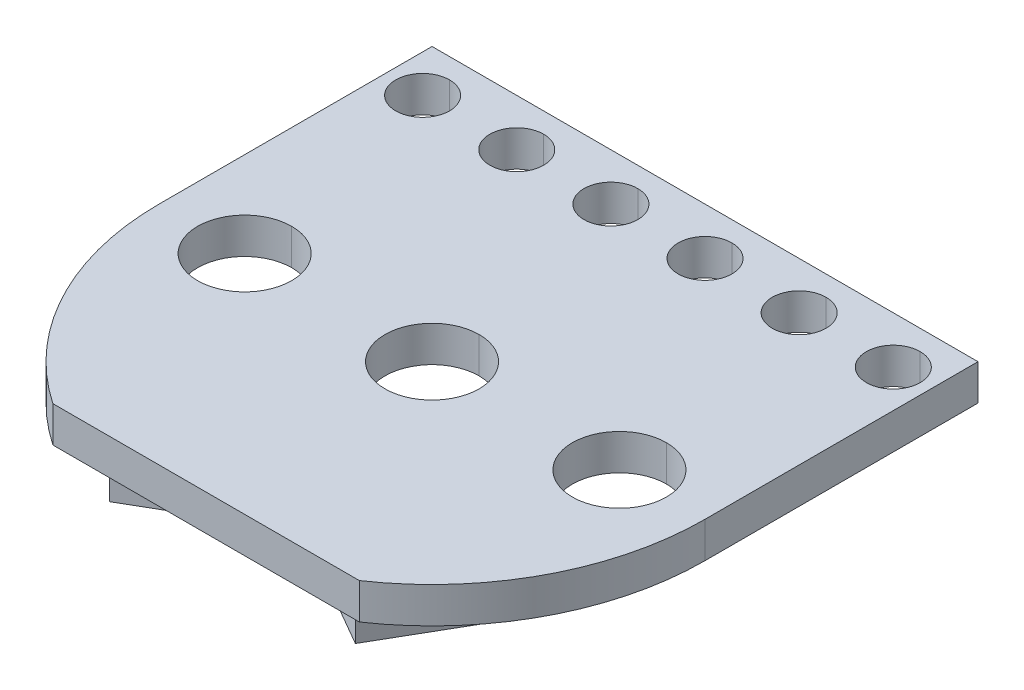
ISO-10303-21;
HEADER;
FILE_DESCRIPTION(('STEP AP214'),'2;1');
FILE_NAME('part.step','',(''),(''),'','','');
FILE_SCHEMA(('AUTOMOTIVE_DESIGN { 1 0 10303 214 1 1 1 1 }'));
ENDSEC;
DATA;
#1=APPLICATION_CONTEXT('core data for automotive mechanical design processes');
#2=APPLICATION_PROTOCOL_DEFINITION('international standard','automotive_design',2000,#1);
#3=PRODUCT_CONTEXT('',#1,'mechanical');
#4=PRODUCT('Part','Part','',(#3));
#5=PRODUCT_RELATED_PRODUCT_CATEGORY('part','',(#4));
#6=PRODUCT_DEFINITION_FORMATION('','',#4);
#7=PRODUCT_DEFINITION_CONTEXT('part definition',#1,'design');
#8=PRODUCT_DEFINITION('design','',#6,#7);
#9=PRODUCT_DEFINITION_SHAPE('','',#8);
#10=(LENGTH_UNIT() NAMED_UNIT(*) SI_UNIT(.MILLI.,.METRE.));
#11=(NAMED_UNIT(*) PLANE_ANGLE_UNIT() SI_UNIT($,.RADIAN.));
#12=(NAMED_UNIT(*) SI_UNIT($,.STERADIAN.) SOLID_ANGLE_UNIT());
#13=UNCERTAINTY_MEASURE_WITH_UNIT(LENGTH_MEASURE(1.E-05),#10,'distance_accuracy_value','');
#14=(GEOMETRIC_REPRESENTATION_CONTEXT(3) GLOBAL_UNCERTAINTY_ASSIGNED_CONTEXT((#13)) GLOBAL_UNIT_ASSIGNED_CONTEXT((#10,
#11,#12)) REPRESENTATION_CONTEXT('',''));
#15=CARTESIAN_POINT('',(0.,0.,0.));
#16=DIRECTION('',(0.,0.,1.));
#17=DIRECTION('',(1.,0.,0.));
#18=AXIS2_PLACEMENT_3D('',#15,#16,#17);
#19=CARTESIAN_POINT('',(3.9812,0.762,0.));
#20=DIRECTION('',(0.,-1.,0.));
#21=DIRECTION('',(0.,0.,-1.));
#22=AXIS2_PLACEMENT_3D('',#19,#20,#21);
#23=CYLINDRICAL_SURFACE('',#22,1.);
#24=CARTESIAN_POINT('',(3.9812,0.762,0.));
#25=DIRECTION('',(0.,1.,0.));
#26=DIRECTION('',(0.,0.,1.));
#27=AXIS2_PLACEMENT_3D('',#24,#25,#26);
#28=CIRCLE('',#27,1.);
#29=CARTESIAN_POINT('',(3.9812,0.762,-1.));
#30=VERTEX_POINT('',#29);
#31=CARTESIAN_POINT('',(3.9812,0.762,1.));
#32=VERTEX_POINT('',#31);
#33=EDGE_CURVE('E11',#30,#32,#28,.T.);
#34=ORIENTED_EDGE('',*,*,#33,.T.);
#35=DIRECTION('',(0.,-1.,0.));
#36=VECTOR('',#35,1.);
#37=CARTESIAN_POINT('',(3.9812,0.762,1.));
#38=LINE('',#37,#36);
#39=CARTESIAN_POINT('',(3.9812,0.,1.));
#40=VERTEX_POINT('',#39);
#41=EDGE_CURVE('E27',#32,#40,#38,.T.);
#42=ORIENTED_EDGE('',*,*,#41,.T.);
#43=CARTESIAN_POINT('',(3.9812,0.,0.));
#44=DIRECTION('',(0.,1.,0.));
#45=DIRECTION('',(0.,0.,1.));
#46=AXIS2_PLACEMENT_3D('',#43,#44,#45);
#47=CIRCLE('',#46,1.);
#48=CARTESIAN_POINT('',(3.9812,0.,-1.));
#49=VERTEX_POINT('',#48);
#50=EDGE_CURVE('E590',#49,#40,#47,.T.);
#51=ORIENTED_EDGE('',*,*,#50,.F.);
#52=DIRECTION('',(0.,-1.,0.));
#53=VECTOR('',#52,1.);
#54=CARTESIAN_POINT('',(3.9812,0.762,-1.));
#55=LINE('',#54,#53);
#56=EDGE_CURVE('E454',#30,#49,#55,.T.);
#57=ORIENTED_EDGE('',*,*,#56,.F.);
#58=EDGE_LOOP('',(#34,#42,#51,#57));
#59=FACE_BOUND('',#58,.T.);
#60=ADVANCED_FACE('F16',(#59),#23,.F.);
#61=CARTESIAN_POINT('',(5.,0.762,-4.8));
#62=DIRECTION('',(0.,-1.,0.));
#63=DIRECTION('',(0.,0.,-1.));
#64=AXIS2_PLACEMENT_3D('',#61,#62,#63);
#65=CYLINDRICAL_SURFACE('',#64,0.5715);
#66=CARTESIAN_POINT('',(5.,0.762,-4.8));
#67=DIRECTION('',(0.,1.,0.));
#68=DIRECTION('',(0.,0.,1.));
#69=AXIS2_PLACEMENT_3D('',#66,#67,#68);
#70=CIRCLE('',#69,0.5715);
#71=CARTESIAN_POINT('',(5.,0.762,-5.3715));
#72=VERTEX_POINT('',#71);
#73=CARTESIAN_POINT('',(5.,0.762,-4.2285));
#74=VERTEX_POINT('',#73);
#75=EDGE_CURVE('E392',#72,#74,#70,.T.);
#76=ORIENTED_EDGE('',*,*,#75,.T.);
#77=DIRECTION('',(0.,-1.,0.));
#78=VECTOR('',#77,1.);
#79=CARTESIAN_POINT('',(5.,0.762,-4.2285));
#80=LINE('',#79,#78);
#81=CARTESIAN_POINT('',(5.,0.,-4.2285));
#82=VERTEX_POINT('',#81);
#83=EDGE_CURVE('E375',#74,#82,#80,.T.);
#84=ORIENTED_EDGE('',*,*,#83,.T.);
#85=CARTESIAN_POINT('',(5.,0.,-4.8));
#86=DIRECTION('',(0.,1.,0.));
#87=DIRECTION('',(0.,0.,1.));
#88=AXIS2_PLACEMENT_3D('',#85,#86,#87);
#89=CIRCLE('',#88,0.5715);
#90=CARTESIAN_POINT('',(5.,0.,-5.3715));
#91=VERTEX_POINT('',#90);
#92=EDGE_CURVE('E474',#91,#82,#89,.T.);
#93=ORIENTED_EDGE('',*,*,#92,.F.);
#94=DIRECTION('',(0.,-1.,0.));
#95=VECTOR('',#94,1.);
#96=CARTESIAN_POINT('',(5.,0.762,-5.3715));
#97=LINE('',#96,#95);
#98=EDGE_CURVE('E417',#72,#91,#97,.T.);
#99=ORIENTED_EDGE('',*,*,#98,.F.);
#100=EDGE_LOOP('',(#76,#84,#93,#99));
#101=FACE_BOUND('',#100,.T.);
#102=ADVANCED_FACE('F703',(#101),#65,.F.);
#103=CARTESIAN_POINT('',(3.,0.762,-4.8));
#104=DIRECTION('',(0.,-1.,0.));
#105=DIRECTION('',(0.,0.,-1.));
#106=AXIS2_PLACEMENT_3D('',#103,#104,#105);
#107=CYLINDRICAL_SURFACE('',#106,0.5715);
#108=CARTESIAN_POINT('',(3.,0.762,-4.8));
#109=DIRECTION('',(0.,1.,0.));
#110=DIRECTION('',(0.,0.,1.));
#111=AXIS2_PLACEMENT_3D('',#108,#109,#110);
#112=CIRCLE('',#111,0.5715);
#113=CARTESIAN_POINT('',(3.,0.762,-5.3715));
#114=VERTEX_POINT('',#113);
#115=CARTESIAN_POINT('',(3.,0.762,-4.2285));
#116=VERTEX_POINT('',#115);
#117=EDGE_CURVE('E372',#114,#116,#112,.T.);
#118=ORIENTED_EDGE('',*,*,#117,.T.);
#119=DIRECTION('',(0.,-1.,0.));
#120=VECTOR('',#119,1.);
#121=CARTESIAN_POINT('',(3.,0.762,-4.2285));
#122=LINE('',#121,#120);
#123=CARTESIAN_POINT('',(3.,0.,-4.2285));
#124=VERTEX_POINT('',#123);
#125=EDGE_CURVE('E333',#116,#124,#122,.T.);
#126=ORIENTED_EDGE('',*,*,#125,.T.);
#127=CARTESIAN_POINT('',(3.,0.,-4.8));
#128=DIRECTION('',(0.,1.,0.));
#129=DIRECTION('',(0.,0.,1.));
#130=AXIS2_PLACEMENT_3D('',#127,#128,#129);
#131=CIRCLE('',#130,0.5715);
#132=CARTESIAN_POINT('',(3.,0.,-5.3715));
#133=VERTEX_POINT('',#132);
#134=EDGE_CURVE('E475',#133,#124,#131,.T.);
#135=ORIENTED_EDGE('',*,*,#134,.F.);
#136=DIRECTION('',(0.,-1.,0.));
#137=VECTOR('',#136,1.);
#138=CARTESIAN_POINT('',(3.,0.762,-5.3715));
#139=LINE('',#138,#137);
#140=EDGE_CURVE('E353',#114,#133,#139,.T.);
#141=ORIENTED_EDGE('',*,*,#140,.F.);
#142=EDGE_LOOP('',(#118,#126,#135,#141));
#143=FACE_BOUND('',#142,.T.);
#144=ADVANCED_FACE('F708',(#143),#107,.F.);
#145=CARTESIAN_POINT('',(1.,0.762,-4.8));
#146=DIRECTION('',(0.,-1.,0.));
#147=DIRECTION('',(0.,0.,-1.));
#148=AXIS2_PLACEMENT_3D('',#145,#146,#147);
#149=CYLINDRICAL_SURFACE('',#148,0.5715);
#150=CARTESIAN_POINT('',(1.,0.762,-4.8));
#151=DIRECTION('',(0.,1.,0.));
#152=DIRECTION('',(0.,0.,1.));
#153=AXIS2_PLACEMENT_3D('',#150,#151,#152);
#154=CIRCLE('',#153,0.5715);
#155=CARTESIAN_POINT('',(1.,0.762,-5.3715));
#156=VERTEX_POINT('',#155);
#157=CARTESIAN_POINT('',(1.,0.762,-4.2285));
#158=VERTEX_POINT('',#157);
#159=EDGE_CURVE('E325',#156,#158,#154,.T.);
#160=ORIENTED_EDGE('',*,*,#159,.T.);
#161=DIRECTION('',(0.,-1.,0.));
#162=VECTOR('',#161,1.);
#163=CARTESIAN_POINT('',(1.,0.762,-4.2285));
#164=LINE('',#163,#162);
#165=CARTESIAN_POINT('',(1.,0.,-4.2285));
#166=VERTEX_POINT('',#165);
#167=EDGE_CURVE('E315',#158,#166,#164,.T.);
#168=ORIENTED_EDGE('',*,*,#167,.T.);
#169=CARTESIAN_POINT('',(1.,0.,-4.8));
#170=DIRECTION('',(0.,1.,0.));
#171=DIRECTION('',(0.,0.,1.));
#172=AXIS2_PLACEMENT_3D('',#169,#170,#171);
#173=CIRCLE('',#172,0.5715);
#174=CARTESIAN_POINT('',(1.,0.,-5.3715));
#175=VERTEX_POINT('',#174);
#176=EDGE_CURVE('E490',#175,#166,#173,.T.);
#177=ORIENTED_EDGE('',*,*,#176,.F.);
#178=DIRECTION('',(0.,-1.,0.));
#179=VECTOR('',#178,1.);
#180=CARTESIAN_POINT('',(1.,0.762,-5.3715));
#181=LINE('',#180,#179);
#182=EDGE_CURVE('E330',#156,#175,#181,.T.);
#183=ORIENTED_EDGE('',*,*,#182,.F.);
#184=EDGE_LOOP('',(#160,#168,#177,#183));
#185=FACE_BOUND('',#184,.T.);
#186=ADVANCED_FACE('F329',(#185),#149,.F.);
#187=CARTESIAN_POINT('',(-1.,0.762,-4.8));
#188=DIRECTION('',(0.,-1.,0.));
#189=DIRECTION('',(0.,0.,-1.));
#190=AXIS2_PLACEMENT_3D('',#187,#188,#189);
#191=CYLINDRICAL_SURFACE('',#190,0.5715);
#192=CARTESIAN_POINT('',(-1.,0.762,-4.8));
#193=DIRECTION('',(0.,1.,0.));
#194=DIRECTION('',(0.,0.,1.));
#195=AXIS2_PLACEMENT_3D('',#192,#193,#194);
#196=CIRCLE('',#195,0.5715);
#197=CARTESIAN_POINT('',(-1.,0.762,-5.3715));
#198=VERTEX_POINT('',#197);
#199=CARTESIAN_POINT('',(-1.,0.762,-4.2285));
#200=VERTEX_POINT('',#199);
#201=EDGE_CURVE('E326',#198,#200,#196,.T.);
#202=ORIENTED_EDGE('',*,*,#201,.T.);
#203=DIRECTION('',(0.,-1.,0.));
#204=VECTOR('',#203,1.);
#205=CARTESIAN_POINT('',(-1.,0.762,-4.2285));
#206=LINE('',#205,#204);
#207=CARTESIAN_POINT('',(-1.,0.,-4.2285));
#208=VERTEX_POINT('',#207);
#209=EDGE_CURVE('E357',#200,#208,#206,.T.);
#210=ORIENTED_EDGE('',*,*,#209,.T.);
#211=CARTESIAN_POINT('',(-1.,0.,-4.8));
#212=DIRECTION('',(0.,1.,0.));
#213=DIRECTION('',(0.,0.,1.));
#214=AXIS2_PLACEMENT_3D('',#211,#212,#213);
#215=CIRCLE('',#214,0.5715);
#216=CARTESIAN_POINT('',(-1.,0.,-5.3715));
#217=VERTEX_POINT('',#216);
#218=EDGE_CURVE('E449',#217,#208,#215,.T.);
#219=ORIENTED_EDGE('',*,*,#218,.F.);
#220=DIRECTION('',(0.,-1.,0.));
#221=VECTOR('',#220,1.);
#222=CARTESIAN_POINT('',(-1.,0.762,-5.3715));
#223=LINE('',#222,#221);
#224=EDGE_CURVE('E338',#198,#217,#223,.T.);
#225=ORIENTED_EDGE('',*,*,#224,.F.);
#226=EDGE_LOOP('',(#202,#210,#219,#225));
#227=FACE_BOUND('',#226,.T.);
#228=ADVANCED_FACE('F717',(#227),#191,.F.);
#229=CARTESIAN_POINT('',(-3.9812,0.762,0.));
#230=DIRECTION('',(0.,-1.,0.));
#231=DIRECTION('',(0.,0.,-1.));
#232=AXIS2_PLACEMENT_3D('',#229,#230,#231);
#233=CYLINDRICAL_SURFACE('',#232,1.);
#234=CARTESIAN_POINT('',(-3.9812,0.762,0.));
#235=DIRECTION('',(0.,1.,0.));
#236=DIRECTION('',(0.,0.,1.));
#237=AXIS2_PLACEMENT_3D('',#234,#235,#236);
#238=CIRCLE('',#237,1.);
#239=CARTESIAN_POINT('',(-3.9812,0.762,-1.));
#240=VERTEX_POINT('',#239);
#241=CARTESIAN_POINT('',(-3.9812,0.762,1.));
#242=VERTEX_POINT('',#241);
#243=EDGE_CURVE('E361',#240,#242,#238,.T.);
#244=ORIENTED_EDGE('',*,*,#243,.T.);
#245=DIRECTION('',(0.,-1.,0.));
#246=VECTOR('',#245,1.);
#247=CARTESIAN_POINT('',(-3.9812,0.762,1.));
#248=LINE('',#247,#246);
#249=CARTESIAN_POINT('',(-3.9812,0.,1.));
#250=VERTEX_POINT('',#249);
#251=EDGE_CURVE('E362',#242,#250,#248,.T.);
#252=ORIENTED_EDGE('',*,*,#251,.T.);
#253=CARTESIAN_POINT('',(-3.9812,0.,0.));
#254=DIRECTION('',(0.,1.,0.));
#255=DIRECTION('',(0.,0.,1.));
#256=AXIS2_PLACEMENT_3D('',#253,#254,#255);
#257=CIRCLE('',#256,1.);
#258=CARTESIAN_POINT('',(-3.9812,0.,-1.));
#259=VERTEX_POINT('',#258);
#260=EDGE_CURVE('E499',#259,#250,#257,.T.);
#261=ORIENTED_EDGE('',*,*,#260,.F.);
#262=DIRECTION('',(0.,-1.,0.));
#263=VECTOR('',#262,1.);
#264=CARTESIAN_POINT('',(-3.9812,0.762,-1.));
#265=LINE('',#264,#263);
#266=EDGE_CURVE('E461',#240,#259,#265,.T.);
#267=ORIENTED_EDGE('',*,*,#266,.F.);
#268=EDGE_LOOP('',(#244,#252,#261,#267));
#269=FACE_BOUND('',#268,.T.);
#270=ADVANCED_FACE('F765',(#269),#233,.F.);
#271=CARTESIAN_POINT('',(-3.,0.762,-4.8));
#272=DIRECTION('',(0.,-1.,0.));
#273=DIRECTION('',(0.,0.,-1.));
#274=AXIS2_PLACEMENT_3D('',#271,#272,#273);
#275=CYLINDRICAL_SURFACE('',#274,0.5715);
#276=CARTESIAN_POINT('',(-3.,0.762,-4.8));
#277=DIRECTION('',(0.,1.,0.));
#278=DIRECTION('',(0.,0.,1.));
#279=AXIS2_PLACEMENT_3D('',#276,#277,#278);
#280=CIRCLE('',#279,0.5715);
#281=CARTESIAN_POINT('',(-3.,0.762,-5.3715));
#282=VERTEX_POINT('',#281);
#283=CARTESIAN_POINT('',(-3.,0.762,-4.2285));
#284=VERTEX_POINT('',#283);
#285=EDGE_CURVE('E366',#282,#284,#280,.T.);
#286=ORIENTED_EDGE('',*,*,#285,.T.);
#287=DIRECTION('',(0.,-1.,0.));
#288=VECTOR('',#287,1.);
#289=CARTESIAN_POINT('',(-3.,0.762,-4.2285));
#290=LINE('',#289,#288);
#291=CARTESIAN_POINT('',(-3.,0.,-4.2285));
#292=VERTEX_POINT('',#291);
#293=EDGE_CURVE('E555',#284,#292,#290,.T.);
#294=ORIENTED_EDGE('',*,*,#293,.T.);
#295=CARTESIAN_POINT('',(-3.,0.,-4.8));
#296=DIRECTION('',(0.,1.,0.));
#297=DIRECTION('',(0.,0.,1.));
#298=AXIS2_PLACEMENT_3D('',#295,#296,#297);
#299=CIRCLE('',#298,0.5715);
#300=CARTESIAN_POINT('',(-3.,0.,-5.3715));
#301=VERTEX_POINT('',#300);
#302=EDGE_CURVE('E448',#301,#292,#299,.T.);
#303=ORIENTED_EDGE('',*,*,#302,.F.);
#304=DIRECTION('',(0.,-1.,0.));
#305=VECTOR('',#304,1.);
#306=CARTESIAN_POINT('',(-3.,0.762,-5.3715));
#307=LINE('',#306,#305);
#308=EDGE_CURVE('E518',#282,#301,#307,.T.);
#309=ORIENTED_EDGE('',*,*,#308,.F.);
#310=EDGE_LOOP('',(#286,#294,#303,#309));
#311=FACE_BOUND('',#310,.T.);
#312=ADVANCED_FACE('F761',(#311),#275,.F.);
#313=CARTESIAN_POINT('',(0.,0.762,0.));
#314=DIRECTION('',(0.,-1.,0.));
#315=DIRECTION('',(0.,0.,-1.));
#316=AXIS2_PLACEMENT_3D('',#313,#314,#315);
#317=CYLINDRICAL_SURFACE('',#316,1.);
#318=CARTESIAN_POINT('',(0.,0.762,0.));
#319=DIRECTION('',(0.,1.,0.));
#320=DIRECTION('',(0.,0.,1.));
#321=AXIS2_PLACEMENT_3D('',#318,#319,#320);
#322=CIRCLE('',#321,1.);
#323=CARTESIAN_POINT('',(0.,0.762,-1.));
#324=VERTEX_POINT('',#323);
#325=CARTESIAN_POINT('',(0.,0.762,1.));
#326=VERTEX_POINT('',#325);
#327=EDGE_CURVE('E559',#324,#326,#322,.T.);
#328=ORIENTED_EDGE('',*,*,#327,.T.);
#329=DIRECTION('',(0.,-1.,0.));
#330=VECTOR('',#329,1.);
#331=CARTESIAN_POINT('',(0.,0.762,1.));
#332=LINE('',#331,#330);
#333=CARTESIAN_POINT('',(0.,0.,1.));
#334=VERTEX_POINT('',#333);
#335=EDGE_CURVE('E624',#326,#334,#332,.T.);
#336=ORIENTED_EDGE('',*,*,#335,.T.);
#337=CARTESIAN_POINT('',(0.,0.,0.));
#338=DIRECTION('',(0.,1.,0.));
#339=DIRECTION('',(0.,0.,1.));
#340=AXIS2_PLACEMENT_3D('',#337,#338,#339);
#341=CIRCLE('',#340,1.);
#342=CARTESIAN_POINT('',(0.,0.,-1.));
#343=VERTEX_POINT('',#342);
#344=EDGE_CURVE('E443',#343,#334,#341,.T.);
#345=ORIENTED_EDGE('',*,*,#344,.F.);
#346=DIRECTION('',(0.,-1.,0.));
#347=VECTOR('',#346,1.);
#348=CARTESIAN_POINT('',(0.,0.762,-1.));
#349=LINE('',#348,#347);
#350=EDGE_CURVE('E155',#324,#343,#349,.T.);
#351=ORIENTED_EDGE('',*,*,#350,.F.);
#352=EDGE_LOOP('',(#328,#336,#345,#351));
#353=FACE_BOUND('',#352,.T.);
#354=ADVANCED_FACE('F754',(#353),#317,.F.);
#355=CARTESIAN_POINT('',(-5.,0.762,-4.8));
#356=DIRECTION('',(0.,-1.,0.));
#357=DIRECTION('',(0.,0.,-1.));
#358=AXIS2_PLACEMENT_3D('',#355,#356,#357);
#359=CYLINDRICAL_SURFACE('',#358,0.5715);
#360=CARTESIAN_POINT('',(-5.,0.762,-4.8));
#361=DIRECTION('',(0.,1.,0.));
#362=DIRECTION('',(0.,0.,1.));
#363=AXIS2_PLACEMENT_3D('',#360,#361,#362);
#364=CIRCLE('',#363,0.5715);
#365=CARTESIAN_POINT('',(-5.,0.762,-5.3715));
#366=VERTEX_POINT('',#365);
#367=CARTESIAN_POINT('',(-5.,0.762,-4.2285));
#368=VERTEX_POINT('',#367);
#369=EDGE_CURVE('E628',#366,#368,#364,.T.);
#370=ORIENTED_EDGE('',*,*,#369,.T.);
#371=DIRECTION('',(0.,-1.,0.));
#372=VECTOR('',#371,1.);
#373=CARTESIAN_POINT('',(-5.,0.762,-4.2285));
#374=LINE('',#373,#372);
#375=CARTESIAN_POINT('',(-5.,0.,-4.2285));
#376=VERTEX_POINT('',#375);
#377=EDGE_CURVE('E469',#368,#376,#374,.T.);
#378=ORIENTED_EDGE('',*,*,#377,.T.);
#379=CARTESIAN_POINT('',(-5.,0.,-4.8));
#380=DIRECTION('',(0.,1.,0.));
#381=DIRECTION('',(0.,0.,1.));
#382=AXIS2_PLACEMENT_3D('',#379,#380,#381);
#383=CIRCLE('',#382,0.5715);
#384=CARTESIAN_POINT('',(-5.,0.,-5.3715));
#385=VERTEX_POINT('',#384);
#386=EDGE_CURVE('E444',#385,#376,#383,.T.);
#387=ORIENTED_EDGE('',*,*,#386,.F.);
#388=DIRECTION('',(0.,-1.,0.));
#389=VECTOR('',#388,1.);
#390=CARTESIAN_POINT('',(-5.,0.762,-5.3715));
#391=LINE('',#390,#389);
#392=EDGE_CURVE('E382',#366,#385,#391,.T.);
#393=ORIENTED_EDGE('',*,*,#392,.F.);
#394=EDGE_LOOP('',(#370,#378,#387,#393));
#395=FACE_BOUND('',#394,.T.);
#396=ADVANCED_FACE('F750',(#395),#359,.F.);
#397=CARTESIAN_POINT('',(-5.8,0.762,4.8));
#398=DIRECTION('',(1.,0.,0.));
#399=DIRECTION('',(0.,0.,1.));
#400=AXIS2_PLACEMENT_3D('',#397,#398,#399);
#401=PLANE('',#400);
#402=DIRECTION('',(0.,1.,0.));
#403=VECTOR('',#402,1.);
#404=CARTESIAN_POINT('',(-5.8,-5.43259939780661,0.));
#405=LINE('',#404,#403);
#406=CARTESIAN_POINT('',(-5.8,0.,0.));
#407=VERTEX_POINT('',#406);
#408=CARTESIAN_POINT('',(-5.8,0.762,0.));
#409=VERTEX_POINT('',#408);
#410=EDGE_CURVE('E465',#407,#409,#405,.T.);
#411=ORIENTED_EDGE('',*,*,#410,.T.);
#412=DIRECTION('',(0.,0.,1.));
#413=VECTOR('',#412,1.);
#414=CARTESIAN_POINT('',(-5.8,0.762,4.8));
#415=LINE('',#414,#413);
#416=CARTESIAN_POINT('',(-5.8,0.762,-5.8));
#417=VERTEX_POINT('',#416);
#418=EDGE_CURVE('E538',#417,#409,#415,.T.);
#419=ORIENTED_EDGE('',*,*,#418,.F.);
#420=DIRECTION('',(0.,-1.,0.));
#421=VECTOR('',#420,1.);
#422=CARTESIAN_POINT('',(-5.8,0.762,-5.8));
#423=LINE('',#422,#421);
#424=CARTESIAN_POINT('',(-5.8,0.,-5.8));
#425=VERTEX_POINT('',#424);
#426=EDGE_CURVE('E470',#417,#425,#423,.T.);
#427=ORIENTED_EDGE('',*,*,#426,.T.);
#428=DIRECTION('',(0.,0.,1.));
#429=VECTOR('',#428,1.);
#430=CARTESIAN_POINT('',(-5.8,0.,4.8));
#431=LINE('',#430,#429);
#432=EDGE_CURVE('E541',#425,#407,#431,.T.);
#433=ORIENTED_EDGE('',*,*,#432,.T.);
#434=EDGE_LOOP('',(#411,#419,#427,#433));
#435=FACE_BOUND('',#434,.T.);
#436=ADVANCED_FACE('F753',(#435),#401,.F.);
#437=CARTESIAN_POINT('',(0.,0.762,0.));
#438=DIRECTION('',(0.,-1.,0.));
#439=DIRECTION('',(0.,0.,-1.));
#440=AXIS2_PLACEMENT_3D('',#437,#438,#439);
#441=PLANE('',#440);
#442=ORIENTED_EDGE('',*,*,#418,.T.);
#443=CARTESIAN_POINT('',(0.,0.762,0.));
#444=DIRECTION('',(0.,-1.,0.));
#445=DIRECTION('',(0.,0.,1.));
#446=AXIS2_PLACEMENT_3D('',#443,#444,#445);
#447=CIRCLE('',#446,5.8);
#448=CARTESIAN_POINT('',(-3.25576411921995,0.762,4.8));
#449=VERTEX_POINT('',#448);
#450=EDGE_CURVE('E409',#449,#409,#447,.T.);
#451=ORIENTED_EDGE('',*,*,#450,.F.);
#452=DIRECTION('',(1.,0.,0.));
#453=VECTOR('',#452,1.);
#454=CARTESIAN_POINT('',(-5.8,0.762,4.8));
#455=LINE('',#454,#453);
#456=CARTESIAN_POINT('',(3.25576411921995,0.762,4.8));
#457=VERTEX_POINT('',#456);
#458=EDGE_CURVE('E529',#449,#457,#455,.T.);
#459=ORIENTED_EDGE('',*,*,#458,.T.);
#460=CARTESIAN_POINT('',(0.,0.762,0.));
#461=DIRECTION('',(0.,-1.,0.));
#462=DIRECTION('',(0.,0.,-1.));
#463=AXIS2_PLACEMENT_3D('',#460,#461,#462);
#464=CIRCLE('',#463,5.8);
#465=CARTESIAN_POINT('',(5.8,0.762,0.));
#466=VERTEX_POINT('',#465);
#467=EDGE_CURVE('E546',#466,#457,#464,.T.);
#468=ORIENTED_EDGE('',*,*,#467,.F.);
#469=DIRECTION('',(0.,0.,-1.));
#470=VECTOR('',#469,1.);
#471=CARTESIAN_POINT('',(5.8,0.762,4.8));
#472=LINE('',#471,#470);
#473=CARTESIAN_POINT('',(5.8,0.762,-5.8));
#474=VERTEX_POINT('',#473);
#475=EDGE_CURVE('E525',#466,#474,#472,.T.);
#476=ORIENTED_EDGE('',*,*,#475,.T.);
#477=DIRECTION('',(-1.,0.,0.));
#478=VECTOR('',#477,1.);
#479=CARTESIAN_POINT('',(-5.8,0.762,-5.8));
#480=LINE('',#479,#478);
#481=EDGE_CURVE('E530',#474,#417,#480,.T.);
#482=ORIENTED_EDGE('',*,*,#481,.T.);
#483=EDGE_LOOP('',(#442,#451,#459,#468,#476,#482));
#484=FACE_BOUND('',#483,.T.);
#485=ORIENTED_EDGE('',*,*,#369,.F.);
#486=CARTESIAN_POINT('',(-5.,0.762,-4.8));
#487=DIRECTION('',(0.,1.,0.));
#488=DIRECTION('',(0.,0.,1.));
#489=AXIS2_PLACEMENT_3D('',#486,#487,#488);
#490=CIRCLE('',#489,0.5715);
#491=EDGE_CURVE('E377',#368,#366,#490,.T.);
#492=ORIENTED_EDGE('',*,*,#491,.F.);
#493=EDGE_LOOP('',(#485,#492));
#494=FACE_BOUND('',#493,.T.);
#495=ORIENTED_EDGE('',*,*,#327,.F.);
#496=CARTESIAN_POINT('',(0.,0.762,0.));
#497=DIRECTION('',(0.,1.,0.));
#498=DIRECTION('',(0.,0.,1.));
#499=AXIS2_PLACEMENT_3D('',#496,#497,#498);
#500=CIRCLE('',#499,1.);
#501=EDGE_CURVE('E551',#326,#324,#500,.T.);
#502=ORIENTED_EDGE('',*,*,#501,.F.);
#503=EDGE_LOOP('',(#495,#502));
#504=FACE_BOUND('',#503,.T.);
#505=ORIENTED_EDGE('',*,*,#285,.F.);
#506=CARTESIAN_POINT('',(-3.,0.762,-4.8));
#507=DIRECTION('',(0.,1.,0.));
#508=DIRECTION('',(0.,0.,1.));
#509=AXIS2_PLACEMENT_3D('',#506,#507,#508);
#510=CIRCLE('',#509,0.5715);
#511=EDGE_CURVE('E521',#284,#282,#510,.T.);
#512=ORIENTED_EDGE('',*,*,#511,.F.);
#513=EDGE_LOOP('',(#505,#512));
#514=FACE_BOUND('',#513,.T.);
#515=ORIENTED_EDGE('',*,*,#243,.F.);
#516=CARTESIAN_POINT('',(-3.9812,0.762,0.));
#517=DIRECTION('',(0.,1.,0.));
#518=DIRECTION('',(0.,0.,1.));
#519=AXIS2_PLACEMENT_3D('',#516,#517,#518);
#520=CIRCLE('',#519,1.);
#521=EDGE_CURVE('E464',#242,#240,#520,.T.);
#522=ORIENTED_EDGE('',*,*,#521,.F.);
#523=EDGE_LOOP('',(#515,#522));
#524=FACE_BOUND('',#523,.T.);
#525=ORIENTED_EDGE('',*,*,#201,.F.);
#526=CARTESIAN_POINT('',(-1.,0.762,-4.8));
#527=DIRECTION('',(0.,1.,0.));
#528=DIRECTION('',(0.,0.,1.));
#529=AXIS2_PLACEMENT_3D('',#526,#527,#528);
#530=CIRCLE('',#529,0.5715);
#531=EDGE_CURVE('E344',#200,#198,#530,.T.);
#532=ORIENTED_EDGE('',*,*,#531,.F.);
#533=EDGE_LOOP('',(#525,#532));
#534=FACE_BOUND('',#533,.T.);
#535=ORIENTED_EDGE('',*,*,#159,.F.);
#536=CARTESIAN_POINT('',(1.,0.762,-4.8));
#537=DIRECTION('',(0.,1.,0.));
#538=DIRECTION('',(0.,0.,1.));
#539=AXIS2_PLACEMENT_3D('',#536,#537,#538);
#540=CIRCLE('',#539,0.5715);
#541=EDGE_CURVE('E319',#158,#156,#540,.T.);
#542=ORIENTED_EDGE('',*,*,#541,.F.);
#543=EDGE_LOOP('',(#535,#542));
#544=FACE_BOUND('',#543,.T.);
#545=ORIENTED_EDGE('',*,*,#117,.F.);
#546=CARTESIAN_POINT('',(3.,0.762,-4.8));
#547=DIRECTION('',(0.,1.,0.));
#548=DIRECTION('',(0.,0.,1.));
#549=AXIS2_PLACEMENT_3D('',#546,#547,#548);
#550=CIRCLE('',#549,0.5715);
#551=EDGE_CURVE('E347',#116,#114,#550,.T.);
#552=ORIENTED_EDGE('',*,*,#551,.F.);
#553=EDGE_LOOP('',(#545,#552));
#554=FACE_BOUND('',#553,.T.);
#555=ORIENTED_EDGE('',*,*,#75,.F.);
#556=CARTESIAN_POINT('',(5.,0.762,-4.8));
#557=DIRECTION('',(0.,1.,0.));
#558=DIRECTION('',(0.,0.,1.));
#559=AXIS2_PLACEMENT_3D('',#556,#557,#558);
#560=CIRCLE('',#559,0.5715);
#561=EDGE_CURVE('E356',#74,#72,#560,.T.);
#562=ORIENTED_EDGE('',*,*,#561,.F.);
#563=EDGE_LOOP('',(#555,#562));
#564=FACE_BOUND('',#563,.T.);
#565=ORIENTED_EDGE('',*,*,#33,.F.);
#566=CARTESIAN_POINT('',(3.9812,0.762,0.));
#567=DIRECTION('',(0.,1.,0.));
#568=DIRECTION('',(0.,0.,1.));
#569=AXIS2_PLACEMENT_3D('',#566,#567,#568);
#570=CIRCLE('',#569,1.);
#571=EDGE_CURVE('E438',#32,#30,#570,.T.);
#572=ORIENTED_EDGE('',*,*,#571,.F.);
#573=EDGE_LOOP('',(#565,#572));
#574=FACE_BOUND('',#573,.T.);
#575=ADVANCED_FACE('F335',(#484,#494,#504,#514,#524,#534,#544,#554,#564,#574),#441,.F.);
#576=CARTESIAN_POINT('',(0.,0.,0.));
#577=DIRECTION('',(0.,-1.,0.));
#578=DIRECTION('',(0.,0.,-1.));
#579=AXIS2_PLACEMENT_3D('',#576,#577,#578);
#580=PLANE('',#579);
#581=CARTESIAN_POINT('',(0.,0.,0.));
#582=DIRECTION('',(0.,-1.,0.));
#583=DIRECTION('',(0.,0.,-1.));
#584=AXIS2_PLACEMENT_3D('',#581,#582,#583);
#585=CIRCLE('',#584,5.8);
#586=CARTESIAN_POINT('',(-3.25576411921995,0.,4.8));
#587=VERTEX_POINT('',#586);
#588=EDGE_CURVE('E604',#587,#407,#585,.T.);
#589=ORIENTED_EDGE('',*,*,#588,.T.);
#590=ORIENTED_EDGE('',*,*,#432,.F.);
#591=DIRECTION('',(-1.,0.,0.));
#592=VECTOR('',#591,1.);
#593=CARTESIAN_POINT('',(-5.8,0.,-5.8));
#594=LINE('',#593,#592);
#595=CARTESIAN_POINT('',(5.8,0.,-5.8));
#596=VERTEX_POINT('',#595);
#597=EDGE_CURVE('E403',#596,#425,#594,.T.);
#598=ORIENTED_EDGE('',*,*,#597,.F.);
#599=DIRECTION('',(0.,0.,-1.));
#600=VECTOR('',#599,1.);
#601=CARTESIAN_POINT('',(5.8,0.,4.8));
#602=LINE('',#601,#600);
#603=CARTESIAN_POINT('',(5.8,0.,0.));
#604=VERTEX_POINT('',#603);
#605=EDGE_CURVE('E496',#604,#596,#602,.T.);
#606=ORIENTED_EDGE('',*,*,#605,.F.);
#607=CARTESIAN_POINT('',(0.,0.,0.));
#608=DIRECTION('',(0.,-1.,0.));
#609=DIRECTION('',(0.,0.,-1.));
#610=AXIS2_PLACEMENT_3D('',#607,#608,#609);
#611=CIRCLE('',#610,5.8);
#612=CARTESIAN_POINT('',(3.25576411921995,0.,4.8));
#613=VERTEX_POINT('',#612);
#614=EDGE_CURVE('E421',#604,#613,#611,.T.);
#615=ORIENTED_EDGE('',*,*,#614,.T.);
#616=DIRECTION('',(1.,0.,0.));
#617=VECTOR('',#616,1.);
#618=CARTESIAN_POINT('',(-5.8,0.,4.8));
#619=LINE('',#618,#617);
#620=EDGE_CURVE('E404',#587,#613,#619,.T.);
#621=ORIENTED_EDGE('',*,*,#620,.F.);
#622=EDGE_LOOP('',(#589,#590,#598,#606,#615,#621));
#623=FACE_BOUND('',#622,.T.);
#624=DIRECTION('',(0.866025403784453,0.,0.499999999999976));
#625=VECTOR('',#624,1.);
#626=CARTESIAN_POINT('',(2.60982032302758,0.,4.23903810567657));
#627=LINE('',#626,#625);
#628=CARTESIAN_POINT('',(1.22417967697245,0.,3.43903810567662));
#629=VERTEX_POINT('',#628);
#630=CARTESIAN_POINT('',(2.60982032302758,0.,4.23903810567657));
#631=VERTEX_POINT('',#630);
#632=EDGE_CURVE('E418',#629,#631,#627,.T.);
#633=ORIENTED_EDGE('',*,*,#632,.T.);
#634=DIRECTION('',(0.499999999999989,0.,-0.866025403784445));
#635=VECTOR('',#634,1.);
#636=CARTESIAN_POINT('',(2.60982032302758,0.,4.23903810567657));
#637=LINE('',#636,#635);
#638=CARTESIAN_POINT('',(4.10982032302754,0.,1.64096189432324));
#639=VERTEX_POINT('',#638);
#640=EDGE_CURVE('E422',#631,#639,#637,.T.);
#641=ORIENTED_EDGE('',*,*,#640,.T.);
#642=DIRECTION('',(-0.866025403784446,0.,-0.499999999999988));
#643=VECTOR('',#642,1.);
#644=CARTESIAN_POINT('',(4.10982032302754,0.,1.64096189432324));
#645=LINE('',#644,#643);
#646=CARTESIAN_POINT('',(2.72417967697243,0.,0.840961894323257));
#647=VERTEX_POINT('',#646);
#648=EDGE_CURVE('E531',#639,#647,#645,.T.);
#649=ORIENTED_EDGE('',*,*,#648,.T.);
#650=DIRECTION('',(-0.499999999999987,0.,0.866025403784446));
#651=VECTOR('',#650,1.);
#652=CARTESIAN_POINT('',(1.22417967697246,0.,3.43903810567662));
#653=LINE('',#652,#651);
#654=EDGE_CURVE('E370',#647,#629,#653,.T.);
#655=ORIENTED_EDGE('',*,*,#654,.T.);
#656=EDGE_LOOP('',(#633,#641,#649,#655));
#657=FACE_BOUND('',#656,.T.);
#658=DIRECTION('',(-0.866025403784442,0.,0.5));
#659=VECTOR('',#658,1.);
#660=CARTESIAN_POINT('',(-4.10982032302755,0.,1.64096189432325));
#661=LINE('',#660,#659);
#662=CARTESIAN_POINT('',(-2.72417967697244,0.,0.840961894323256));
#663=VERTEX_POINT('',#662);
#664=CARTESIAN_POINT('',(-4.10982032302755,0.,1.64096189432325));
#665=VERTEX_POINT('',#664);
#666=EDGE_CURVE('E367',#663,#665,#661,.T.);
#667=ORIENTED_EDGE('',*,*,#666,.T.);
#668=DIRECTION('',(0.5,0.,0.866025403784442));
#669=VECTOR('',#668,1.);
#670=CARTESIAN_POINT('',(-4.10982032302755,0.,1.64096189432325));
#671=LINE('',#670,#669);
#672=CARTESIAN_POINT('',(-2.60982032302757,0.,4.23903810567657));
#673=VERTEX_POINT('',#672);
#674=EDGE_CURVE('E371',#665,#673,#671,.T.);
#675=ORIENTED_EDGE('',*,*,#674,.T.);
#676=DIRECTION('',(0.866025403784442,0.,-0.5));
#677=VECTOR('',#676,1.);
#678=CARTESIAN_POINT('',(-2.60982032302757,0.,4.23903810567657));
#679=LINE('',#678,#677);
#680=CARTESIAN_POINT('',(-1.22417967697246,0.,3.43903810567658));
#681=VERTEX_POINT('',#680);
#682=EDGE_CURVE('E473',#673,#681,#679,.T.);
#683=ORIENTED_EDGE('',*,*,#682,.T.);
#684=DIRECTION('',(-0.5,0.,-0.866025403784442));
#685=VECTOR('',#684,1.);
#686=CARTESIAN_POINT('',(-2.72417967697244,0.,0.840961894323256));
#687=LINE('',#686,#685);
#688=EDGE_CURVE('E245',#681,#663,#687,.T.);
#689=ORIENTED_EDGE('',*,*,#688,.T.);
#690=EDGE_LOOP('',(#667,#675,#683,#689));
#691=FACE_BOUND('',#690,.T.);
#692=ORIENTED_EDGE('',*,*,#92,.T.);
#693=CARTESIAN_POINT('',(5.,0.,-4.8));
#694=DIRECTION('',(0.,1.,0.));
#695=DIRECTION('',(0.,0.,1.));
#696=AXIS2_PLACEMENT_3D('',#693,#694,#695);
#697=CIRCLE('',#696,0.5715);
#698=EDGE_CURVE('E484',#82,#91,#697,.T.);
#699=ORIENTED_EDGE('',*,*,#698,.T.);
#700=EDGE_LOOP('',(#692,#699));
#701=FACE_BOUND('',#700,.T.);
#702=ORIENTED_EDGE('',*,*,#176,.T.);
#703=CARTESIAN_POINT('',(1.,0.,-4.8));
#704=DIRECTION('',(0.,1.,0.));
#705=DIRECTION('',(0.,0.,1.));
#706=AXIS2_PLACEMENT_3D('',#703,#704,#705);
#707=CIRCLE('',#706,0.5715);
#708=EDGE_CURVE('E321',#166,#175,#707,.T.);
#709=ORIENTED_EDGE('',*,*,#708,.T.);
#710=EDGE_LOOP('',(#702,#709));
#711=FACE_BOUND('',#710,.T.);
#712=ORIENTED_EDGE('',*,*,#260,.T.);
#713=CARTESIAN_POINT('',(-3.9812,0.,0.));
#714=DIRECTION('',(0.,1.,0.));
#715=DIRECTION('',(0.,0.,1.));
#716=AXIS2_PLACEMENT_3D('',#713,#714,#715);
#717=CIRCLE('',#716,1.);
#718=EDGE_CURVE('E507',#250,#259,#717,.T.);
#719=ORIENTED_EDGE('',*,*,#718,.T.);
#720=EDGE_LOOP('',(#712,#719));
#721=FACE_BOUND('',#720,.T.);
#722=ORIENTED_EDGE('',*,*,#344,.T.);
#723=CARTESIAN_POINT('',(0.,0.,0.));
#724=DIRECTION('',(0.,1.,0.));
#725=DIRECTION('',(0.,0.,1.));
#726=AXIS2_PLACEMENT_3D('',#723,#724,#725);
#727=CIRCLE('',#726,1.);
#728=EDGE_CURVE('E439',#334,#343,#727,.T.);
#729=ORIENTED_EDGE('',*,*,#728,.T.);
#730=EDGE_LOOP('',(#722,#729));
#731=FACE_BOUND('',#730,.T.);
#732=ORIENTED_EDGE('',*,*,#386,.T.);
#733=CARTESIAN_POINT('',(-5.,0.,-4.8));
#734=DIRECTION('',(0.,1.,0.));
#735=DIRECTION('',(0.,0.,1.));
#736=AXIS2_PLACEMENT_3D('',#733,#734,#735);
#737=CIRCLE('',#736,0.5715);
#738=EDGE_CURVE('E460',#376,#385,#737,.T.);
#739=ORIENTED_EDGE('',*,*,#738,.T.);
#740=EDGE_LOOP('',(#732,#739));
#741=FACE_BOUND('',#740,.T.);
#742=ORIENTED_EDGE('',*,*,#302,.T.);
#743=CARTESIAN_POINT('',(-3.,0.,-4.8));
#744=DIRECTION('',(0.,1.,0.));
#745=DIRECTION('',(0.,0.,1.));
#746=AXIS2_PLACEMENT_3D('',#743,#744,#745);
#747=CIRCLE('',#746,0.5715);
#748=EDGE_CURVE('E445',#292,#301,#747,.T.);
#749=ORIENTED_EDGE('',*,*,#748,.T.);
#750=EDGE_LOOP('',(#742,#749));
#751=FACE_BOUND('',#750,.T.);
#752=ORIENTED_EDGE('',*,*,#218,.T.);
#753=CARTESIAN_POINT('',(-1.,0.,-4.8));
#754=DIRECTION('',(0.,1.,0.));
#755=DIRECTION('',(0.,0.,1.));
#756=AXIS2_PLACEMENT_3D('',#753,#754,#755);
#757=CIRCLE('',#756,0.5715);
#758=EDGE_CURVE('E478',#208,#217,#757,.T.);
#759=ORIENTED_EDGE('',*,*,#758,.T.);
#760=EDGE_LOOP('',(#752,#759));
#761=FACE_BOUND('',#760,.T.);
#762=ORIENTED_EDGE('',*,*,#134,.T.);
#763=CARTESIAN_POINT('',(3.,0.,-4.8));
#764=DIRECTION('',(0.,1.,0.));
#765=DIRECTION('',(0.,0.,1.));
#766=AXIS2_PLACEMENT_3D('',#763,#764,#765);
#767=CIRCLE('',#766,0.5715);
#768=EDGE_CURVE('E20',#124,#133,#767,.T.);
#769=ORIENTED_EDGE('',*,*,#768,.T.);
#770=EDGE_LOOP('',(#762,#769));
#771=FACE_BOUND('',#770,.T.);
#772=ORIENTED_EDGE('',*,*,#50,.T.);
#773=CARTESIAN_POINT('',(3.9812,0.,0.));
#774=DIRECTION('',(0.,1.,0.));
#775=DIRECTION('',(0.,0.,1.));
#776=AXIS2_PLACEMENT_3D('',#773,#774,#775);
#777=CIRCLE('',#776,1.);
#778=EDGE_CURVE('E503',#40,#49,#777,.T.);
#779=ORIENTED_EDGE('',*,*,#778,.T.);
#780=EDGE_LOOP('',(#772,#779));
#781=FACE_BOUND('',#780,.T.);
#782=ADVANCED_FACE('F595',(#623,#657,#691,#701,#711,#721,#731,#741,#751,#761,#771,#781),#580,.T.);
#783=CARTESIAN_POINT('',(5.8,0.762,4.8));
#784=DIRECTION('',(-1.,0.,0.));
#785=DIRECTION('',(0.,0.,1.));
#786=AXIS2_PLACEMENT_3D('',#783,#784,#785);
#787=PLANE('',#786);
#788=ORIENTED_EDGE('',*,*,#475,.F.);
#789=DIRECTION('',(0.,1.,0.));
#790=VECTOR('',#789,1.);
#791=CARTESIAN_POINT('',(5.8,-5.43259939780661,0.));
#792=LINE('',#791,#790);
#793=EDGE_CURVE('E457',#604,#466,#792,.T.);
#794=ORIENTED_EDGE('',*,*,#793,.F.);
#795=ORIENTED_EDGE('',*,*,#605,.T.);
#796=DIRECTION('',(0.,-1.,0.));
#797=VECTOR('',#796,1.);
#798=CARTESIAN_POINT('',(5.8,0.762,-5.8));
#799=LINE('',#798,#797);
#800=EDGE_CURVE('E399',#474,#596,#799,.T.);
#801=ORIENTED_EDGE('',*,*,#800,.F.);
#802=EDGE_LOOP('',(#788,#794,#795,#801));
#803=FACE_BOUND('',#802,.T.);
#804=ADVANCED_FACE('F713',(#803),#787,.F.);
#805=CARTESIAN_POINT('',(-5.8,0.762,-5.8));
#806=DIRECTION('',(0.,0.,1.));
#807=DIRECTION('',(1.,0.,0.));
#808=AXIS2_PLACEMENT_3D('',#805,#806,#807);
#809=PLANE('',#808);
#810=ORIENTED_EDGE('',*,*,#597,.T.);
#811=ORIENTED_EDGE('',*,*,#426,.F.);
#812=ORIENTED_EDGE('',*,*,#481,.F.);
#813=ORIENTED_EDGE('',*,*,#800,.T.);
#814=EDGE_LOOP('',(#810,#811,#812,#813));
#815=FACE_BOUND('',#814,.T.);
#816=ADVANCED_FACE('F835',(#815),#809,.F.);
#817=CARTESIAN_POINT('',(-5.8,0.762,4.8));
#818=DIRECTION('',(0.,0.,-1.));
#819=DIRECTION('',(-1.,0.,0.));
#820=AXIS2_PLACEMENT_3D('',#817,#818,#819);
#821=PLANE('',#820);
#822=ORIENTED_EDGE('',*,*,#458,.F.);
#823=DIRECTION('',(0.,1.,0.));
#824=VECTOR('',#823,1.);
#825=CARTESIAN_POINT('',(-3.25576411921994,-5.43259939780661,4.8));
#826=LINE('',#825,#824);
#827=EDGE_CURVE('E542',#587,#449,#826,.T.);
#828=ORIENTED_EDGE('',*,*,#827,.F.);
#829=ORIENTED_EDGE('',*,*,#620,.T.);
#830=DIRECTION('',(0.,1.,0.));
#831=VECTOR('',#830,1.);
#832=CARTESIAN_POINT('',(3.25576411921995,-5.43259939780661,4.8));
#833=LINE('',#832,#831);
#834=EDGE_CURVE('E381',#613,#457,#833,.T.);
#835=ORIENTED_EDGE('',*,*,#834,.T.);
#836=EDGE_LOOP('',(#822,#828,#829,#835));
#837=FACE_BOUND('',#836,.T.);
#838=ADVANCED_FACE('F743',(#837),#821,.F.);
#839=CARTESIAN_POINT('',(-5.,0.762,-4.8));
#840=DIRECTION('',(0.,-1.,0.));
#841=DIRECTION('',(0.,0.,-1.));
#842=AXIS2_PLACEMENT_3D('',#839,#840,#841);
#843=CYLINDRICAL_SURFACE('',#842,0.5715);
#844=ORIENTED_EDGE('',*,*,#377,.F.);
#845=ORIENTED_EDGE('',*,*,#491,.T.);
#846=ORIENTED_EDGE('',*,*,#392,.T.);
#847=ORIENTED_EDGE('',*,*,#738,.F.);
#848=EDGE_LOOP('',(#844,#845,#846,#847));
#849=FACE_BOUND('',#848,.T.);
#850=ADVANCED_FACE('F739',(#849),#843,.F.);
#851=CARTESIAN_POINT('',(0.,0.762,0.));
#852=DIRECTION('',(0.,-1.,0.));
#853=DIRECTION('',(0.,0.,-1.));
#854=AXIS2_PLACEMENT_3D('',#851,#852,#853);
#855=CYLINDRICAL_SURFACE('',#854,1.);
#856=ORIENTED_EDGE('',*,*,#335,.F.);
#857=ORIENTED_EDGE('',*,*,#501,.T.);
#858=ORIENTED_EDGE('',*,*,#350,.T.);
#859=ORIENTED_EDGE('',*,*,#728,.F.);
#860=EDGE_LOOP('',(#856,#857,#858,#859));
#861=FACE_BOUND('',#860,.T.);
#862=ADVANCED_FACE('F742',(#861),#855,.F.);
#863=CARTESIAN_POINT('',(-3.,0.762,-4.8));
#864=DIRECTION('',(0.,-1.,0.));
#865=DIRECTION('',(0.,0.,-1.));
#866=AXIS2_PLACEMENT_3D('',#863,#864,#865);
#867=CYLINDRICAL_SURFACE('',#866,0.5715);
#868=ORIENTED_EDGE('',*,*,#293,.F.);
#869=ORIENTED_EDGE('',*,*,#511,.T.);
#870=ORIENTED_EDGE('',*,*,#308,.T.);
#871=ORIENTED_EDGE('',*,*,#748,.F.);
#872=EDGE_LOOP('',(#868,#869,#870,#871));
#873=FACE_BOUND('',#872,.T.);
#874=ADVANCED_FACE('F798',(#873),#867,.F.);
#875=CARTESIAN_POINT('',(-3.9812,0.762,0.));
#876=DIRECTION('',(0.,-1.,0.));
#877=DIRECTION('',(0.,0.,-1.));
#878=AXIS2_PLACEMENT_3D('',#875,#876,#877);
#879=CYLINDRICAL_SURFACE('',#878,1.);
#880=ORIENTED_EDGE('',*,*,#251,.F.);
#881=ORIENTED_EDGE('',*,*,#521,.T.);
#882=ORIENTED_EDGE('',*,*,#266,.T.);
#883=ORIENTED_EDGE('',*,*,#718,.F.);
#884=EDGE_LOOP('',(#880,#881,#882,#883));
#885=FACE_BOUND('',#884,.T.);
#886=ADVANCED_FACE('F793',(#885),#879,.F.);
#887=CARTESIAN_POINT('',(-1.,0.762,-4.8));
#888=DIRECTION('',(0.,-1.,0.));
#889=DIRECTION('',(0.,0.,-1.));
#890=AXIS2_PLACEMENT_3D('',#887,#888,#889);
#891=CYLINDRICAL_SURFACE('',#890,0.5715);
#892=ORIENTED_EDGE('',*,*,#209,.F.);
#893=ORIENTED_EDGE('',*,*,#531,.T.);
#894=ORIENTED_EDGE('',*,*,#224,.T.);
#895=ORIENTED_EDGE('',*,*,#758,.F.);
#896=EDGE_LOOP('',(#892,#893,#894,#895));
#897=FACE_BOUND('',#896,.T.);
#898=ADVANCED_FACE('F759',(#897),#891,.F.);
#899=CARTESIAN_POINT('',(1.,0.762,-4.8));
#900=DIRECTION('',(0.,-1.,0.));
#901=DIRECTION('',(0.,0.,-1.));
#902=AXIS2_PLACEMENT_3D('',#899,#900,#901);
#903=CYLINDRICAL_SURFACE('',#902,0.5715);
#904=ORIENTED_EDGE('',*,*,#167,.F.);
#905=ORIENTED_EDGE('',*,*,#541,.T.);
#906=ORIENTED_EDGE('',*,*,#182,.T.);
#907=ORIENTED_EDGE('',*,*,#708,.F.);
#908=EDGE_LOOP('',(#904,#905,#906,#907));
#909=FACE_BOUND('',#908,.T.);
#910=ADVANCED_FACE('F317',(#909),#903,.F.);
#911=CARTESIAN_POINT('',(3.,0.762,-4.8));
#912=DIRECTION('',(0.,-1.,0.));
#913=DIRECTION('',(0.,0.,-1.));
#914=AXIS2_PLACEMENT_3D('',#911,#912,#913);
#915=CYLINDRICAL_SURFACE('',#914,0.5715);
#916=ORIENTED_EDGE('',*,*,#125,.F.);
#917=ORIENTED_EDGE('',*,*,#551,.T.);
#918=ORIENTED_EDGE('',*,*,#140,.T.);
#919=ORIENTED_EDGE('',*,*,#768,.F.);
#920=EDGE_LOOP('',(#916,#917,#918,#919));
#921=FACE_BOUND('',#920,.T.);
#922=ADVANCED_FACE('F745',(#921),#915,.F.);
#923=CARTESIAN_POINT('',(5.,0.762,-4.8));
#924=DIRECTION('',(0.,-1.,0.));
#925=DIRECTION('',(0.,0.,-1.));
#926=AXIS2_PLACEMENT_3D('',#923,#924,#925);
#927=CYLINDRICAL_SURFACE('',#926,0.5715);
#928=ORIENTED_EDGE('',*,*,#83,.F.);
#929=ORIENTED_EDGE('',*,*,#561,.T.);
#930=ORIENTED_EDGE('',*,*,#98,.T.);
#931=ORIENTED_EDGE('',*,*,#698,.F.);
#932=EDGE_LOOP('',(#928,#929,#930,#931));
#933=FACE_BOUND('',#932,.T.);
#934=ADVANCED_FACE('F748',(#933),#927,.F.);
#935=CARTESIAN_POINT('',(3.9812,0.762,0.));
#936=DIRECTION('',(0.,-1.,0.));
#937=DIRECTION('',(0.,0.,-1.));
#938=AXIS2_PLACEMENT_3D('',#935,#936,#937);
#939=CYLINDRICAL_SURFACE('',#938,1.);
#940=ORIENTED_EDGE('',*,*,#41,.F.);
#941=ORIENTED_EDGE('',*,*,#571,.T.);
#942=ORIENTED_EDGE('',*,*,#56,.T.);
#943=ORIENTED_EDGE('',*,*,#778,.F.);
#944=EDGE_LOOP('',(#940,#941,#942,#943));
#945=FACE_BOUND('',#944,.T.);
#946=ADVANCED_FACE('F585',(#945),#939,.F.);
#947=CARTESIAN_POINT('',(0.,-5.43259939780661,0.));
#948=DIRECTION('',(0.,1.,0.));
#949=DIRECTION('',(0.,0.,1.));
#950=AXIS2_PLACEMENT_3D('',#947,#948,#949);
#951=CYLINDRICAL_SURFACE('',#950,5.8);
#952=ORIENTED_EDGE('',*,*,#793,.T.);
#953=ORIENTED_EDGE('',*,*,#467,.T.);
#954=ORIENTED_EDGE('',*,*,#834,.F.);
#955=ORIENTED_EDGE('',*,*,#614,.F.);
#956=EDGE_LOOP('',(#952,#953,#954,#955));
#957=FACE_BOUND('',#956,.T.);
#958=ADVANCED_FACE('F723',(#957),#951,.T.);
#959=CARTESIAN_POINT('',(0.,-5.43259939780661,0.));
#960=DIRECTION('',(0.,1.,0.));
#961=DIRECTION('',(0.,0.,1.));
#962=AXIS2_PLACEMENT_3D('',#959,#960,#961);
#963=CYLINDRICAL_SURFACE('',#962,5.8);
#964=ORIENTED_EDGE('',*,*,#827,.T.);
#965=ORIENTED_EDGE('',*,*,#450,.T.);
#966=ORIENTED_EDGE('',*,*,#410,.F.);
#967=ORIENTED_EDGE('',*,*,#588,.F.);
#968=EDGE_LOOP('',(#964,#965,#966,#967));
#969=FACE_BOUND('',#968,.T.);
#970=ADVANCED_FACE('F698',(#969),#963,.T.);
#971=CARTESIAN_POINT('',(-4.10982032302755,-1.,1.64096189432325));
#972=DIRECTION('',(-0.5,0.,-0.866025403784442));
#973=DIRECTION('',(-0.866025403784442,0.,0.5));
#974=AXIS2_PLACEMENT_3D('',#971,#972,#973);
#975=PLANE('',#974);
#976=ORIENTED_EDGE('',*,*,#666,.F.);
#977=DIRECTION('',(0.,1.,0.));
#978=VECTOR('',#977,1.);
#979=CARTESIAN_POINT('',(-2.72417967697244,-1.,0.840961894323256));
#980=LINE('',#979,#978);
#981=CARTESIAN_POINT('',(-2.72417967697244,-1.,0.840961894323256));
#982=VERTEX_POINT('',#981);
#983=EDGE_CURVE('E427',#982,#663,#980,.T.);
#984=ORIENTED_EDGE('',*,*,#983,.F.);
#985=DIRECTION('',(-0.866025403784442,0.,0.5));
#986=VECTOR('',#985,1.);
#987=CARTESIAN_POINT('',(-4.10982032302755,-1.,1.64096189432325));
#988=LINE('',#987,#986);
#989=CARTESIAN_POINT('',(-4.10982032302755,-1.,1.64096189432325));
#990=VERTEX_POINT('',#989);
#991=EDGE_CURVE('E405',#982,#990,#988,.T.);
#992=ORIENTED_EDGE('',*,*,#991,.T.);
#993=DIRECTION('',(0.,1.,0.));
#994=VECTOR('',#993,1.);
#995=CARTESIAN_POINT('',(-4.10982032302755,-1.,1.64096189432325));
#996=LINE('',#995,#994);
#997=EDGE_CURVE('E410',#990,#665,#996,.T.);
#998=ORIENTED_EDGE('',*,*,#997,.T.);
#999=EDGE_LOOP('',(#976,#984,#992,#998));
#1000=FACE_BOUND('',#999,.T.);
#1001=ADVANCED_FACE('F689',(#1000),#975,.T.);
#1002=CARTESIAN_POINT('',(-2.72417967697244,-1.,0.840961894323256));
#1003=DIRECTION('',(0.866025403784442,0.,-0.5));
#1004=DIRECTION('',(0.,-1.,0.));
#1005=AXIS2_PLACEMENT_3D('',#1002,#1003,#1004);
#1006=PLANE('',#1005);
#1007=ORIENTED_EDGE('',*,*,#688,.F.);
#1008=DIRECTION('',(0.,1.,0.));
#1009=VECTOR('',#1008,1.);
#1010=CARTESIAN_POINT('',(-1.22417967697246,-1.,3.43903810567658));
#1011=LINE('',#1010,#1009);
#1012=CARTESIAN_POINT('',(-1.22417967697246,-1.,3.43903810567658));
#1013=VERTEX_POINT('',#1012);
#1014=EDGE_CURVE('E383',#1013,#681,#1011,.T.);
#1015=ORIENTED_EDGE('',*,*,#1014,.F.);
#1016=DIRECTION('',(-0.5,0.,-0.866025403784442));
#1017=VECTOR('',#1016,1.);
#1018=CARTESIAN_POINT('',(-2.72417967697244,-1.,0.840961894323256));
#1019=LINE('',#1018,#1017);
#1020=EDGE_CURVE('E430',#1013,#982,#1019,.T.);
#1021=ORIENTED_EDGE('',*,*,#1020,.T.);
#1022=ORIENTED_EDGE('',*,*,#983,.T.);
#1023=EDGE_LOOP('',(#1007,#1015,#1021,#1022));
#1024=FACE_BOUND('',#1023,.T.);
#1025=ADVANCED_FACE('F690',(#1024),#1006,.T.);
#1026=CARTESIAN_POINT('',(-2.60982032302757,-1.,4.23903810567657));
#1027=DIRECTION('',(0.5,0.,0.866025403784442));
#1028=DIRECTION('',(0.,-1.,0.));
#1029=AXIS2_PLACEMENT_3D('',#1026,#1027,#1028);
#1030=PLANE('',#1029);
#1031=ORIENTED_EDGE('',*,*,#682,.F.);
#1032=DIRECTION('',(0.,1.,0.));
#1033=VECTOR('',#1032,1.);
#1034=CARTESIAN_POINT('',(-2.60982032302757,-1.,4.23903810567657));
#1035=LINE('',#1034,#1033);
#1036=CARTESIAN_POINT('',(-2.60982032302757,-1.,4.23903810567657));
#1037=VERTEX_POINT('',#1036);
#1038=EDGE_CURVE('E397',#1037,#673,#1035,.T.);
#1039=ORIENTED_EDGE('',*,*,#1038,.F.);
#1040=DIRECTION('',(0.866025403784442,0.,-0.5));
#1041=VECTOR('',#1040,1.);
#1042=CARTESIAN_POINT('',(-2.60982032302757,-1.,4.23903810567657));
#1043=LINE('',#1042,#1041);
#1044=EDGE_CURVE('E387',#1037,#1013,#1043,.T.);
#1045=ORIENTED_EDGE('',*,*,#1044,.T.);
#1046=ORIENTED_EDGE('',*,*,#1014,.T.);
#1047=EDGE_LOOP('',(#1031,#1039,#1045,#1046));
#1048=FACE_BOUND('',#1047,.T.);
#1049=ADVANCED_FACE('F18',(#1048),#1030,.T.);
#1050=CARTESIAN_POINT('',(-4.10982032302755,-1.,1.64096189432325));
#1051=DIRECTION('',(-0.866025403784442,0.,0.5));
#1052=DIRECTION('',(0.,1.,0.));
#1053=AXIS2_PLACEMENT_3D('',#1050,#1051,#1052);
#1054=PLANE('',#1053);
#1055=ORIENTED_EDGE('',*,*,#674,.F.);
#1056=ORIENTED_EDGE('',*,*,#997,.F.);
#1057=DIRECTION('',(0.5,0.,0.866025403784442));
#1058=VECTOR('',#1057,1.);
#1059=CARTESIAN_POINT('',(-4.10982032302755,-1.,1.64096189432325));
#1060=LINE('',#1059,#1058);
#1061=EDGE_CURVE('E388',#990,#1037,#1060,.T.);
#1062=ORIENTED_EDGE('',*,*,#1061,.T.);
#1063=ORIENTED_EDGE('',*,*,#1038,.T.);
#1064=EDGE_LOOP('',(#1055,#1056,#1062,#1063));
#1065=FACE_BOUND('',#1064,.T.);
#1066=ADVANCED_FACE('F687',(#1065),#1054,.T.);
#1067=CARTESIAN_POINT('',(0.,-1.,0.));
#1068=DIRECTION('',(0.,-1.,0.));
#1069=DIRECTION('',(0.,0.,-1.));
#1070=AXIS2_PLACEMENT_3D('',#1067,#1068,#1069);
#1071=PLANE('',#1070);
#1072=ORIENTED_EDGE('',*,*,#991,.F.);
#1073=ORIENTED_EDGE('',*,*,#1020,.F.);
#1074=ORIENTED_EDGE('',*,*,#1044,.F.);
#1075=ORIENTED_EDGE('',*,*,#1061,.F.);
#1076=EDGE_LOOP('',(#1072,#1073,#1074,#1075));
#1077=FACE_BOUND('',#1076,.T.);
#1078=ADVANCED_FACE('F685',(#1077),#1071,.T.);
#1079=CARTESIAN_POINT('',(2.60982032302758,-1.,4.23903810567657));
#1080=DIRECTION('',(-0.499999999999976,0.,0.866025403784453));
#1081=DIRECTION('',(0.,1.,0.));
#1082=AXIS2_PLACEMENT_3D('',#1079,#1080,#1081);
#1083=PLANE('',#1082);
#1084=ORIENTED_EDGE('',*,*,#632,.F.);
#1085=DIRECTION('',(0.,1.,0.));
#1086=VECTOR('',#1085,1.);
#1087=CARTESIAN_POINT('',(1.22417967697246,-1.,3.43903810567662));
#1088=LINE('',#1087,#1086);
#1089=CARTESIAN_POINT('',(1.22417967697246,-1.,3.43903810567662));
#1090=VERTEX_POINT('',#1089);
#1091=EDGE_CURVE('E431',#1090,#629,#1088,.T.);
#1092=ORIENTED_EDGE('',*,*,#1091,.F.);
#1093=DIRECTION('',(0.866025403784453,0.,0.499999999999976));
#1094=VECTOR('',#1093,1.);
#1095=CARTESIAN_POINT('',(2.60982032302758,-1.,4.23903810567657));
#1096=LINE('',#1095,#1094);
#1097=CARTESIAN_POINT('',(2.60982032302758,-1.,4.23903810567657));
#1098=VERTEX_POINT('',#1097);
#1099=EDGE_CURVE('E393',#1090,#1098,#1096,.T.);
#1100=ORIENTED_EDGE('',*,*,#1099,.T.);
#1101=DIRECTION('',(0.,1.,0.));
#1102=VECTOR('',#1101,1.);
#1103=CARTESIAN_POINT('',(2.60982032302758,-1.,4.23903810567657));
#1104=LINE('',#1103,#1102);
#1105=EDGE_CURVE('E398',#1098,#631,#1104,.T.);
#1106=ORIENTED_EDGE('',*,*,#1105,.T.);
#1107=EDGE_LOOP('',(#1084,#1092,#1100,#1106));
#1108=FACE_BOUND('',#1107,.T.);
#1109=ADVANCED_FACE('F720',(#1108),#1083,.T.);
#1110=CARTESIAN_POINT('',(1.22417967697246,-1.,3.43903810567662));
#1111=DIRECTION('',(-0.866025403784446,0.,-0.499999999999987));
#1112=DIRECTION('',(-0.499999999999987,0.,0.866025403784446));
#1113=AXIS2_PLACEMENT_3D('',#1110,#1111,#1112);
#1114=PLANE('',#1113);
#1115=ORIENTED_EDGE('',*,*,#654,.F.);
#1116=DIRECTION('',(0.,1.,0.));
#1117=VECTOR('',#1116,1.);
#1118=CARTESIAN_POINT('',(2.72417967697243,-1.,0.840961894323257));
#1119=LINE('',#1118,#1117);
#1120=CARTESIAN_POINT('',(2.72417967697243,-1.,0.840961894323257));
#1121=VERTEX_POINT('',#1120);
#1122=EDGE_CURVE('E517',#1121,#647,#1119,.T.);
#1123=ORIENTED_EDGE('',*,*,#1122,.F.);
#1124=DIRECTION('',(-0.499999999999987,0.,0.866025403784446));
#1125=VECTOR('',#1124,1.);
#1126=CARTESIAN_POINT('',(1.22417967697246,-1.,3.43903810567662));
#1127=LINE('',#1126,#1125);
#1128=EDGE_CURVE('E350',#1121,#1090,#1127,.T.);
#1129=ORIENTED_EDGE('',*,*,#1128,.T.);
#1130=ORIENTED_EDGE('',*,*,#1091,.T.);
#1131=EDGE_LOOP('',(#1115,#1123,#1129,#1130));
#1132=FACE_BOUND('',#1131,.T.);
#1133=ADVANCED_FACE('F827',(#1132),#1114,.T.);
#1134=CARTESIAN_POINT('',(4.10982032302754,-1.,1.64096189432324));
#1135=DIRECTION('',(0.499999999999988,0.,-0.866025403784446));
#1136=DIRECTION('',(0.,-1.,0.));
#1137=AXIS2_PLACEMENT_3D('',#1134,#1135,#1136);
#1138=PLANE('',#1137);
#1139=ORIENTED_EDGE('',*,*,#648,.F.);
#1140=DIRECTION('',(0.,1.,0.));
#1141=VECTOR('',#1140,1.);
#1142=CARTESIAN_POINT('',(4.10982032302754,-1.,1.64096189432324));
#1143=LINE('',#1142,#1141);
#1144=CARTESIAN_POINT('',(4.10982032302754,-1.,1.64096189432324));
#1145=VERTEX_POINT('',#1144);
#1146=EDGE_CURVE('E611',#1145,#639,#1143,.T.);
#1147=ORIENTED_EDGE('',*,*,#1146,.F.);
#1148=DIRECTION('',(-0.866025403784446,0.,-0.499999999999988));
#1149=VECTOR('',#1148,1.);
#1150=CARTESIAN_POINT('',(4.10982032302754,-1.,1.64096189432324));
#1151=LINE('',#1150,#1149);
#1152=EDGE_CURVE('E435',#1145,#1121,#1151,.T.);
#1153=ORIENTED_EDGE('',*,*,#1152,.T.);
#1154=ORIENTED_EDGE('',*,*,#1122,.T.);
#1155=EDGE_LOOP('',(#1139,#1147,#1153,#1154));
#1156=FACE_BOUND('',#1155,.T.);
#1157=ADVANCED_FACE('F729',(#1156),#1138,.T.);
#1158=CARTESIAN_POINT('',(2.60982032302758,-1.,4.23903810567657));
#1159=DIRECTION('',(0.866025403784445,0.,0.499999999999989));
#1160=DIRECTION('',(0.,-1.,0.));
#1161=AXIS2_PLACEMENT_3D('',#1158,#1159,#1160);
#1162=PLANE('',#1161);
#1163=ORIENTED_EDGE('',*,*,#640,.F.);
#1164=ORIENTED_EDGE('',*,*,#1105,.F.);
#1165=DIRECTION('',(0.499999999999989,0.,-0.866025403784445));
#1166=VECTOR('',#1165,1.);
#1167=CARTESIAN_POINT('',(2.60982032302758,-1.,4.23903810567657));
#1168=LINE('',#1167,#1166);
#1169=EDGE_CURVE('E607',#1098,#1145,#1168,.T.);
#1170=ORIENTED_EDGE('',*,*,#1169,.T.);
#1171=ORIENTED_EDGE('',*,*,#1146,.T.);
#1172=EDGE_LOOP('',(#1163,#1164,#1170,#1171));
#1173=FACE_BOUND('',#1172,.T.);
#1174=ADVANCED_FACE('F725',(#1173),#1162,.T.);
#1175=CARTESIAN_POINT('',(0.,-1.,0.));
#1176=DIRECTION('',(0.,-1.,0.));
#1177=DIRECTION('',(0.,0.,-1.));
#1178=AXIS2_PLACEMENT_3D('',#1175,#1176,#1177);
#1179=PLANE('',#1178);
#1180=ORIENTED_EDGE('',*,*,#1099,.F.);
#1181=ORIENTED_EDGE('',*,*,#1128,.F.);
#1182=ORIENTED_EDGE('',*,*,#1152,.F.);
#1183=ORIENTED_EDGE('',*,*,#1169,.F.);
#1184=EDGE_LOOP('',(#1180,#1181,#1182,#1183));
#1185=FACE_BOUND('',#1184,.T.);
#1186=ADVANCED_FACE('F728',(#1185),#1179,.T.);
#1187=CLOSED_SHELL('',(#60,#102,#144,#186,#228,#270,#312,#354,#396,#436,#575,#782,#804,#816,
#838,#850,#862,#874,#886,#898,#910,#922,#934,#946,#958,#970,#1001,#1025,#1049,#1066,#1078,#1109,
#1133,#1157,#1174,#1186));
#1188=MANIFOLD_SOLID_BREP('B1',#1187);
#1189=ADVANCED_BREP_SHAPE_REPRESENTATION('',(#18,#1188),#14);
#1190=SHAPE_DEFINITION_REPRESENTATION(#9,#1189);
ENDSEC;
END-ISO-10303-21;
